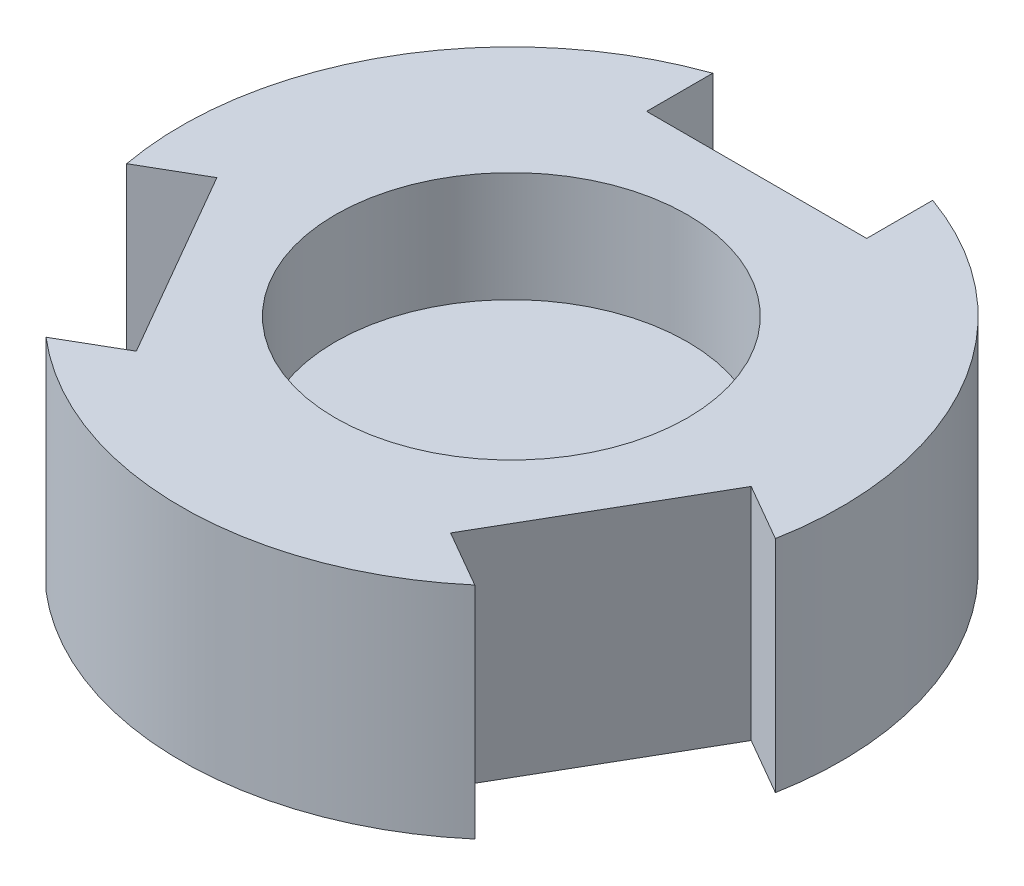
ISO-10303-21;
HEADER;
FILE_DESCRIPTION(('STEP AP214'),'2;1');
FILE_NAME('part.step','',(''),(''),'','','');
FILE_SCHEMA(('AUTOMOTIVE_DESIGN { 1 0 10303 214 1 1 1 1 }'));
ENDSEC;
DATA;
#1=APPLICATION_CONTEXT('core data for automotive mechanical design processes');
#2=APPLICATION_PROTOCOL_DEFINITION('international standard','automotive_design',2000,#1);
#3=PRODUCT_CONTEXT('',#1,'mechanical');
#4=PRODUCT('Part','Part','',(#3));
#5=PRODUCT_RELATED_PRODUCT_CATEGORY('part','',(#4));
#6=PRODUCT_DEFINITION_FORMATION('','',#4);
#7=PRODUCT_DEFINITION_CONTEXT('part definition',#1,'design');
#8=PRODUCT_DEFINITION('design','',#6,#7);
#9=PRODUCT_DEFINITION_SHAPE('','',#8);
#10=(LENGTH_UNIT() NAMED_UNIT(*) SI_UNIT(.MILLI.,.METRE.));
#11=(NAMED_UNIT(*) PLANE_ANGLE_UNIT() SI_UNIT($,.RADIAN.));
#12=(NAMED_UNIT(*) SI_UNIT($,.STERADIAN.) SOLID_ANGLE_UNIT());
#13=UNCERTAINTY_MEASURE_WITH_UNIT(LENGTH_MEASURE(1.E-05),#10,'distance_accuracy_value','');
#14=(GEOMETRIC_REPRESENTATION_CONTEXT(3) GLOBAL_UNCERTAINTY_ASSIGNED_CONTEXT((#13)) GLOBAL_UNIT_ASSIGNED_CONTEXT((#10,
#11,#12)) REPRESENTATION_CONTEXT('',''));
#15=CARTESIAN_POINT('',(0.,0.,0.));
#16=DIRECTION('',(0.,0.,1.));
#17=DIRECTION('',(1.,0.,0.));
#18=AXIS2_PLACEMENT_3D('',#15,#16,#17);
#19=CARTESIAN_POINT('',(0.,10.,0.));
#20=DIRECTION('',(0.,-1.,0.));
#21=DIRECTION('',(0.,0.,-1.));
#22=AXIS2_PLACEMENT_3D('',#19,#20,#21);
#23=CYLINDRICAL_SURFACE('',#22,15.);
#24=CARTESIAN_POINT('',(0.,10.,0.));
#25=DIRECTION('',(0.,1.,0.));
#26=DIRECTION('',(0.,0.,1.));
#27=AXIS2_PLACEMENT_3D('',#24,#25,#26);
#28=CIRCLE('',#27,15.);
#29=CARTESIAN_POINT('',(-4.99312831053746,10.,-14.1445632549934));
#30=VERTEX_POINT('',#29);
#31=CARTESIAN_POINT('',(-14.7487789152188,10.,2.73377404150312));
#32=VERTEX_POINT('',#31);
#33=EDGE_CURVE('E50',#30,#32,#28,.T.);
#34=ORIENTED_EDGE('',*,*,#33,.F.);
#35=DIRECTION('',(0.,-1.,0.));
#36=VECTOR('',#35,1.);
#37=CARTESIAN_POINT('',(-4.99312831053746,10.,-14.1445632549934));
#38=LINE('',#37,#36);
#39=CARTESIAN_POINT('',(-4.99312831053746,0.,-14.1445632549934));
#40=VERTEX_POINT('',#39);
#41=EDGE_CURVE('E148',#40,#30,#38,.F.);
#42=ORIENTED_EDGE('',*,*,#41,.F.);
#43=CARTESIAN_POINT('',(0.,0.,0.));
#44=DIRECTION('',(0.,1.,0.));
#45=DIRECTION('',(0.,0.,1.));
#46=AXIS2_PLACEMENT_3D('',#43,#44,#45);
#47=CIRCLE('',#46,15.);
#48=CARTESIAN_POINT('',(-14.7487789152188,0.,2.73377404150313));
#49=VERTEX_POINT('',#48);
#50=EDGE_CURVE('E211',#40,#49,#47,.T.);
#51=ORIENTED_EDGE('',*,*,#50,.T.);
#52=DIRECTION('',(0.,-1.,0.));
#53=VECTOR('',#52,1.);
#54=CARTESIAN_POINT('',(-14.7487789152188,10.,2.73377404150313));
#55=LINE('',#54,#53);
#56=EDGE_CURVE('E198',#32,#49,#55,.T.);
#57=ORIENTED_EDGE('',*,*,#56,.F.);
#58=EDGE_LOOP('',(#34,#42,#51,#57));
#59=FACE_BOUND('',#58,.T.);
#60=ADVANCED_FACE('F41',(#59),#23,.T.);
#61=CARTESIAN_POINT('',(14.746115259529,0.,2.74810566621536));
#62=VERTEX_POINT('',#61);
#63=CARTESIAN_POINT('',(5.00687168946161,0.,-14.1397042361312));
#64=VERTEX_POINT('',#63);
#65=EDGE_CURVE('E147',#62,#64,#47,.T.);
#66=ORIENTED_EDGE('',*,*,#65,.T.);
#67=DIRECTION('',(0.,-1.,0.));
#68=VECTOR('',#67,1.);
#69=CARTESIAN_POINT('',(5.00687168946161,10.,-14.1397042361312));
#70=LINE('',#69,#68);
#71=CARTESIAN_POINT('',(5.00687168946161,10.,-14.1397042361312));
#72=VERTEX_POINT('',#71);
#73=EDGE_CURVE('E134',#72,#64,#70,.T.);
#74=ORIENTED_EDGE('',*,*,#73,.F.);
#75=CARTESIAN_POINT('',(14.746115259529,10.,2.74810566621536));
#76=VERTEX_POINT('',#75);
#77=EDGE_CURVE('E11',#76,#72,#28,.T.);
#78=ORIENTED_EDGE('',*,*,#77,.F.);
#79=DIRECTION('',(0.,-1.,0.));
#80=VECTOR('',#79,1.);
#81=CARTESIAN_POINT('',(14.746115259529,10.,2.74810566621536));
#82=LINE('',#81,#80);
#83=EDGE_CURVE('E174',#62,#76,#82,.F.);
#84=ORIENTED_EDGE('',*,*,#83,.F.);
#85=EDGE_LOOP('',(#66,#74,#78,#84));
#86=FACE_BOUND('',#85,.T.);
#87=ADVANCED_FACE('F144',(#86),#23,.T.);
#88=CARTESIAN_POINT('',(-9.75298694899117,0.,11.3964575887777));
#89=VERTEX_POINT('',#88);
#90=CARTESIAN_POINT('',(9.74190722575777,0.,11.4059301946281));
#91=VERTEX_POINT('',#90);
#92=EDGE_CURVE('E45',#89,#91,#47,.T.);
#93=ORIENTED_EDGE('',*,*,#92,.T.);
#94=DIRECTION('',(0.,-1.,0.));
#95=VECTOR('',#94,1.);
#96=CARTESIAN_POINT('',(9.74190722575777,10.,11.4059301946281));
#97=LINE('',#96,#95);
#98=CARTESIAN_POINT('',(9.74190722575777,10.,11.4059301946281));
#99=VERTEX_POINT('',#98);
#100=EDGE_CURVE('E149',#99,#91,#97,.T.);
#101=ORIENTED_EDGE('',*,*,#100,.F.);
#102=CARTESIAN_POINT('',(-9.75298694899116,10.,11.3964575887777));
#103=VERTEX_POINT('',#102);
#104=EDGE_CURVE('E51',#103,#99,#28,.T.);
#105=ORIENTED_EDGE('',*,*,#104,.F.);
#106=DIRECTION('',(0.,-1.,0.));
#107=VECTOR('',#106,1.);
#108=CARTESIAN_POINT('',(-9.75298694899117,10.,11.3964575887777));
#109=LINE('',#108,#107);
#110=EDGE_CURVE('E196',#89,#103,#109,.F.);
#111=ORIENTED_EDGE('',*,*,#110,.F.);
#112=EDGE_LOOP('',(#93,#101,#105,#111));
#113=FACE_BOUND('',#112,.T.);
#114=ADVANCED_FACE('F43',(#113),#23,.T.);
#115=CARTESIAN_POINT('',(0.,10.,0.));
#116=DIRECTION('',(0.,1.,0.));
#117=DIRECTION('',(0.,0.,1.));
#118=AXIS2_PLACEMENT_3D('',#115,#116,#117);
#119=PLANE('',#118);
#120=DIRECTION('',(0.,0.,1.));
#121=VECTOR('',#120,1.);
#122=CARTESIAN_POINT('',(-4.99312831053746,10.,-14.139704236132));
#123=LINE('',#122,#121);
#124=CARTESIAN_POINT('',(-4.99312831053747,10.,-11.1397042361319));
#125=VERTEX_POINT('',#124);
#126=EDGE_CURVE('E138',#30,#125,#123,.T.);
#127=ORIENTED_EDGE('',*,*,#126,.F.);
#128=ORIENTED_EDGE('',*,*,#33,.T.);
#129=DIRECTION('',(-0.866025403784439,0.,0.5));
#130=VECTOR('',#129,1.);
#131=CARTESIAN_POINT('',(-16.8261955651492,10.,3.93317110355943));
#132=LINE('',#131,#130);
#133=CARTESIAN_POINT('',(-12.1507027038655,10.,1.23377404150313));
#134=VERTEX_POINT('',#133);
#135=EDGE_CURVE('E186',#134,#32,#132,.T.);
#136=ORIENTED_EDGE('',*,*,#135,.F.);
#137=DIRECTION('',(-0.5,0.,-0.866025403784439));
#138=VECTOR('',#137,1.);
#139=CARTESIAN_POINT('',(-12.1507027038655,10.,1.23377404150313));
#140=LINE('',#139,#138);
#141=CARTESIAN_POINT('',(-7.15070270386598,10.,9.89402807934672));
#142=VERTEX_POINT('',#141);
#143=EDGE_CURVE('E188',#142,#134,#140,.T.);
#144=ORIENTED_EDGE('',*,*,#143,.F.);
#145=DIRECTION('',(0.866025403784439,0.,-0.5));
#146=VECTOR('',#145,1.);
#147=CARTESIAN_POINT('',(-9.74877891521943,10.,11.3940280793468));
#148=LINE('',#147,#146);
#149=EDGE_CURVE('E182',#103,#142,#148,.T.);
#150=ORIENTED_EDGE('',*,*,#149,.F.);
#151=ORIENTED_EDGE('',*,*,#104,.T.);
#152=DIRECTION('',(0.866025403784438,0.,0.500000000000001));
#153=VECTOR('',#152,1.);
#154=CARTESIAN_POINT('',(11.8193238756885,10.,12.6053272566846));
#155=LINE('',#154,#153);
#156=CARTESIAN_POINT('',(7.14383101440485,10.,9.90593019462831));
#157=VERTEX_POINT('',#156);
#158=EDGE_CURVE('E162',#157,#99,#155,.T.);
#159=ORIENTED_EDGE('',*,*,#158,.F.);
#160=DIRECTION('',(-0.5,0.,0.866025403784438));
#161=VECTOR('',#160,1.);
#162=CARTESIAN_POINT('',(7.14383101440485,10.,9.90593019462831));
#163=LINE('',#162,#161);
#164=CARTESIAN_POINT('',(12.1438310144044,10.,1.24567615678472));
#165=VERTEX_POINT('',#164);
#166=EDGE_CURVE('E159',#165,#157,#163,.T.);
#167=ORIENTED_EDGE('',*,*,#166,.F.);
#168=DIRECTION('',(-0.866025403784438,0.,-0.500000000000001));
#169=VECTOR('',#168,1.);
#170=CARTESIAN_POINT('',(14.7419072257578,10.,2.7456761567848));
#171=LINE('',#170,#169);
#172=EDGE_CURVE('E157',#76,#165,#171,.T.);
#173=ORIENTED_EDGE('',*,*,#172,.F.);
#174=ORIENTED_EDGE('',*,*,#77,.T.);
#175=DIRECTION('',(0.,0.,-1.));
#176=VECTOR('',#175,1.);
#177=CARTESIAN_POINT('',(5.00687168946162,10.,-16.5384983602445));
#178=LINE('',#177,#176);
#179=CARTESIAN_POINT('',(5.00687168946161,10.,-11.1397042361318));
#180=VERTEX_POINT('',#179);
#181=EDGE_CURVE('E131',#180,#72,#178,.T.);
#182=ORIENTED_EDGE('',*,*,#181,.F.);
#183=DIRECTION('',(1.,0.,0.));
#184=VECTOR('',#183,1.);
#185=CARTESIAN_POINT('',(5.00687168946161,10.,-11.1397042361318));
#186=LINE('',#185,#184);
#187=EDGE_CURVE('E139',#125,#180,#186,.T.);
#188=ORIENTED_EDGE('',*,*,#187,.F.);
#189=EDGE_LOOP('',(#127,#128,#136,#144,#150,#151,#159,#167,#173,#174,#182,#188));
#190=FACE_BOUND('',#189,.T.);
#191=CARTESIAN_POINT('',(0.,10.,0.));
#192=DIRECTION('',(0.,1.,0.));
#193=DIRECTION('',(0.,0.,1.));
#194=AXIS2_PLACEMENT_3D('',#191,#192,#193);
#195=CIRCLE('',#194,8.);
#196=CARTESIAN_POINT('',(0.,10.,8.));
#197=VERTEX_POINT('',#196);
#198=EDGE_CURVE('E204',#197,#197,#195,.T.);
#199=ORIENTED_EDGE('',*,*,#198,.F.);
#200=EDGE_LOOP('',(#199));
#201=FACE_BOUND('',#200,.T.);
#202=ADVANCED_FACE('F153',(#190,#201),#119,.T.);
#203=CARTESIAN_POINT('',(0.,0.,0.));
#204=DIRECTION('',(0.,1.,0.));
#205=DIRECTION('',(0.,0.,1.));
#206=AXIS2_PLACEMENT_3D('',#203,#204,#205);
#207=PLANE('',#206);
#208=ORIENTED_EDGE('',*,*,#50,.F.);
#209=DIRECTION('',(0.,0.,-1.));
#210=VECTOR('',#209,1.);
#211=CARTESIAN_POINT('',(-4.99312831053746,0.,-14.139704236132));
#212=LINE('',#211,#210);
#213=CARTESIAN_POINT('',(-4.99312831053747,0.,-11.1397042361319));
#214=VERTEX_POINT('',#213);
#215=EDGE_CURVE('E233',#214,#40,#212,.T.);
#216=ORIENTED_EDGE('',*,*,#215,.F.);
#217=DIRECTION('',(-1.,0.,0.));
#218=VECTOR('',#217,1.);
#219=CARTESIAN_POINT('',(5.00687168946161,0.,-11.1397042361318));
#220=LINE('',#219,#218);
#221=CARTESIAN_POINT('',(5.00687168946161,0.,-11.1397042361318));
#222=VERTEX_POINT('',#221);
#223=EDGE_CURVE('E206',#222,#214,#220,.T.);
#224=ORIENTED_EDGE('',*,*,#223,.F.);
#225=DIRECTION('',(0.,0.,1.));
#226=VECTOR('',#225,1.);
#227=CARTESIAN_POINT('',(5.00687168946162,0.,-16.5384983602445));
#228=LINE('',#227,#226);
#229=EDGE_CURVE('E231',#64,#222,#228,.T.);
#230=ORIENTED_EDGE('',*,*,#229,.F.);
#231=ORIENTED_EDGE('',*,*,#65,.F.);
#232=DIRECTION('',(0.866025403784438,0.,0.500000000000001));
#233=VECTOR('',#232,1.);
#234=CARTESIAN_POINT('',(14.7419072257578,0.,2.7456761567848));
#235=LINE('',#234,#233);
#236=CARTESIAN_POINT('',(12.1438310144044,0.,1.24567615678472));
#237=VERTEX_POINT('',#236);
#238=EDGE_CURVE('E170',#237,#62,#235,.T.);
#239=ORIENTED_EDGE('',*,*,#238,.F.);
#240=DIRECTION('',(0.5,0.,-0.866025403784438));
#241=VECTOR('',#240,1.);
#242=CARTESIAN_POINT('',(7.14383101440485,0.,9.90593019462831));
#243=LINE('',#242,#241);
#244=CARTESIAN_POINT('',(7.14383101440485,0.,9.90593019462831));
#245=VERTEX_POINT('',#244);
#246=EDGE_CURVE('E200',#245,#237,#243,.T.);
#247=ORIENTED_EDGE('',*,*,#246,.F.);
#248=DIRECTION('',(-0.866025403784438,0.,-0.500000000000001));
#249=VECTOR('',#248,1.);
#250=CARTESIAN_POINT('',(11.8193238756885,0.,12.6053272566846));
#251=LINE('',#250,#249);
#252=EDGE_CURVE('E172',#91,#245,#251,.T.);
#253=ORIENTED_EDGE('',*,*,#252,.F.);
#254=ORIENTED_EDGE('',*,*,#92,.F.);
#255=DIRECTION('',(-0.866025403784439,0.,0.5));
#256=VECTOR('',#255,1.);
#257=CARTESIAN_POINT('',(-9.74877891521943,0.,11.3940280793468));
#258=LINE('',#257,#256);
#259=CARTESIAN_POINT('',(-7.15070270386598,0.,9.89402807934672));
#260=VERTEX_POINT('',#259);
#261=EDGE_CURVE('E191',#260,#89,#258,.T.);
#262=ORIENTED_EDGE('',*,*,#261,.F.);
#263=DIRECTION('',(0.5,0.,0.866025403784439));
#264=VECTOR('',#263,1.);
#265=CARTESIAN_POINT('',(-12.1507027038655,0.,1.23377404150313));
#266=LINE('',#265,#264);
#267=CARTESIAN_POINT('',(-12.1507027038655,0.,1.23377404150313));
#268=VERTEX_POINT('',#267);
#269=EDGE_CURVE('E177',#268,#260,#266,.T.);
#270=ORIENTED_EDGE('',*,*,#269,.F.);
#271=DIRECTION('',(0.866025403784439,0.,-0.5));
#272=VECTOR('',#271,1.);
#273=CARTESIAN_POINT('',(-16.8261955651492,0.,3.93317110355943));
#274=LINE('',#273,#272);
#275=EDGE_CURVE('E193',#49,#268,#274,.T.);
#276=ORIENTED_EDGE('',*,*,#275,.F.);
#277=EDGE_LOOP('',(#208,#216,#224,#230,#231,#239,#247,#253,#254,#262,#270,#276));
#278=FACE_BOUND('',#277,.T.);
#279=ADVANCED_FACE('F222',(#278),#207,.F.);
#280=CARTESIAN_POINT('',(0.,5.,0.));
#281=DIRECTION('',(0.,1.,0.));
#282=DIRECTION('',(0.,0.,1.));
#283=AXIS2_PLACEMENT_3D('',#280,#281,#282);
#284=CYLINDRICAL_SURFACE('',#283,8.);
#285=CARTESIAN_POINT('',(0.,5.,0.));
#286=DIRECTION('',(0.,1.,0.));
#287=DIRECTION('',(0.,0.,1.));
#288=AXIS2_PLACEMENT_3D('',#285,#286,#287);
#289=CIRCLE('',#288,8.);
#290=CARTESIAN_POINT('',(0.,5.,8.));
#291=VERTEX_POINT('',#290);
#292=EDGE_CURVE('E201',#291,#291,#289,.T.);
#293=ORIENTED_EDGE('',*,*,#292,.F.);
#294=EDGE_LOOP('',(#293));
#295=FACE_BOUND('',#294,.T.);
#296=ORIENTED_EDGE('',*,*,#198,.T.);
#297=EDGE_LOOP('',(#296));
#298=FACE_BOUND('',#297,.T.);
#299=ADVANCED_FACE('F272',(#295,#298),#284,.F.);
#300=CARTESIAN_POINT('',(0.,5.,0.));
#301=DIRECTION('',(0.,1.,0.));
#302=DIRECTION('',(0.,0.,1.));
#303=AXIS2_PLACEMENT_3D('',#300,#301,#302);
#304=PLANE('',#303);
#305=ORIENTED_EDGE('',*,*,#292,.T.);
#306=EDGE_LOOP('',(#305));
#307=FACE_BOUND('',#306,.T.);
#308=ADVANCED_FACE('F264',(#307),#304,.T.);
#309=CARTESIAN_POINT('',(-9.74877891521943,-0.000999999999999265,11.3940280793468));
#310=DIRECTION('',(0.5,0.,0.866025403784439));
#311=DIRECTION('',(0.866025403784439,0.,-0.5));
#312=AXIS2_PLACEMENT_3D('',#309,#310,#311);
#313=PLANE('',#312);
#314=ORIENTED_EDGE('',*,*,#110,.T.);
#315=ORIENTED_EDGE('',*,*,#149,.T.);
#316=DIRECTION('',(0.,1.,0.));
#317=VECTOR('',#316,1.);
#318=CARTESIAN_POINT('',(-7.15070270386598,-0.000999999999999265,9.89402807934672));
#319=LINE('',#318,#317);
#320=EDGE_CURVE('E180',#260,#142,#319,.T.);
#321=ORIENTED_EDGE('',*,*,#320,.F.);
#322=ORIENTED_EDGE('',*,*,#261,.T.);
#323=EDGE_LOOP('',(#314,#315,#321,#322));
#324=FACE_BOUND('',#323,.T.);
#325=ADVANCED_FACE('F262',(#324),#313,.F.);
#326=CARTESIAN_POINT('',(-16.8261955651492,-0.000999999999999265,3.93317110355943));
#327=DIRECTION('',(-0.5,0.,-0.866025403784439));
#328=DIRECTION('',(-0.866025403784439,0.,0.5));
#329=AXIS2_PLACEMENT_3D('',#326,#327,#328);
#330=PLANE('',#329);
#331=ORIENTED_EDGE('',*,*,#56,.T.);
#332=ORIENTED_EDGE('',*,*,#275,.T.);
#333=DIRECTION('',(0.,1.,0.));
#334=VECTOR('',#333,1.);
#335=CARTESIAN_POINT('',(-12.1507027038655,-0.000999999999999265,1.23377404150313));
#336=LINE('',#335,#334);
#337=EDGE_CURVE('E179',#268,#134,#336,.T.);
#338=ORIENTED_EDGE('',*,*,#337,.T.);
#339=ORIENTED_EDGE('',*,*,#135,.T.);
#340=EDGE_LOOP('',(#331,#332,#338,#339));
#341=FACE_BOUND('',#340,.T.);
#342=ADVANCED_FACE('F257',(#341),#330,.F.);
#343=CARTESIAN_POINT('',(-12.1507027038655,-0.000999999999999265,1.23377404150313));
#344=DIRECTION('',(0.866025403784439,0.,-0.5));
#345=DIRECTION('',(-0.5,0.,-0.866025403784439));
#346=AXIS2_PLACEMENT_3D('',#343,#344,#345);
#347=PLANE('',#346);
#348=ORIENTED_EDGE('',*,*,#269,.T.);
#349=ORIENTED_EDGE('',*,*,#320,.T.);
#350=ORIENTED_EDGE('',*,*,#143,.T.);
#351=ORIENTED_EDGE('',*,*,#337,.F.);
#352=EDGE_LOOP('',(#348,#349,#350,#351));
#353=FACE_BOUND('',#352,.T.);
#354=ADVANCED_FACE('F259',(#353),#347,.F.);
#355=CARTESIAN_POINT('',(14.7419072257578,-0.000999999999999265,2.7456761567848));
#356=DIRECTION('',(0.500000000000001,0.,-0.866025403784438));
#357=DIRECTION('',(-0.866025403784438,0.,-0.500000000000001));
#358=AXIS2_PLACEMENT_3D('',#355,#356,#357);
#359=PLANE('',#358);
#360=ORIENTED_EDGE('',*,*,#83,.T.);
#361=ORIENTED_EDGE('',*,*,#172,.T.);
#362=DIRECTION('',(0.,1.,0.));
#363=VECTOR('',#362,1.);
#364=CARTESIAN_POINT('',(12.1438310144044,-0.000999999999999265,1.24567615678472));
#365=LINE('',#364,#363);
#366=EDGE_CURVE('E163',#237,#165,#365,.T.);
#367=ORIENTED_EDGE('',*,*,#366,.F.);
#368=ORIENTED_EDGE('',*,*,#238,.T.);
#369=EDGE_LOOP('',(#360,#361,#367,#368));
#370=FACE_BOUND('',#369,.T.);
#371=ADVANCED_FACE('F229',(#370),#359,.F.);
#372=CARTESIAN_POINT('',(11.8193238756885,-0.000999999999999265,12.6053272566846));
#373=DIRECTION('',(-0.500000000000001,0.,0.866025403784438));
#374=DIRECTION('',(0.866025403784438,0.,0.500000000000001));
#375=AXIS2_PLACEMENT_3D('',#372,#373,#374);
#376=PLANE('',#375);
#377=ORIENTED_EDGE('',*,*,#100,.T.);
#378=ORIENTED_EDGE('',*,*,#252,.T.);
#379=DIRECTION('',(0.,1.,0.));
#380=VECTOR('',#379,1.);
#381=CARTESIAN_POINT('',(7.14383101440485,-0.000999999999999265,9.90593019462831));
#382=LINE('',#381,#380);
#383=EDGE_CURVE('E66',#245,#157,#382,.T.);
#384=ORIENTED_EDGE('',*,*,#383,.T.);
#385=ORIENTED_EDGE('',*,*,#158,.T.);
#386=EDGE_LOOP('',(#377,#378,#384,#385));
#387=FACE_BOUND('',#386,.T.);
#388=ADVANCED_FACE('F227',(#387),#376,.F.);
#389=CARTESIAN_POINT('',(7.14383101440485,-0.000999999999999265,9.90593019462831));
#390=DIRECTION('',(-0.866025403784438,0.,-0.5));
#391=DIRECTION('',(-0.5,0.,0.866025403784438));
#392=AXIS2_PLACEMENT_3D('',#389,#390,#391);
#393=PLANE('',#392);
#394=ORIENTED_EDGE('',*,*,#246,.T.);
#395=ORIENTED_EDGE('',*,*,#366,.T.);
#396=ORIENTED_EDGE('',*,*,#166,.T.);
#397=ORIENTED_EDGE('',*,*,#383,.F.);
#398=EDGE_LOOP('',(#394,#395,#396,#397));
#399=FACE_BOUND('',#398,.T.);
#400=ADVANCED_FACE('F228',(#399),#393,.F.);
#401=CARTESIAN_POINT('',(-4.99312831053746,-0.000999999999999265,-14.139704236132));
#402=DIRECTION('',(-1.,0.,0.));
#403=DIRECTION('',(0.,0.,1.));
#404=AXIS2_PLACEMENT_3D('',#401,#402,#403);
#405=PLANE('',#404);
#406=ORIENTED_EDGE('',*,*,#41,.T.);
#407=ORIENTED_EDGE('',*,*,#126,.T.);
#408=DIRECTION('',(0.,1.,0.));
#409=VECTOR('',#408,1.);
#410=CARTESIAN_POINT('',(-4.99312831053747,-0.000999999999999265,-11.1397042361319));
#411=LINE('',#410,#409);
#412=EDGE_CURVE('E241',#214,#125,#411,.T.);
#413=ORIENTED_EDGE('',*,*,#412,.F.);
#414=ORIENTED_EDGE('',*,*,#215,.T.);
#415=EDGE_LOOP('',(#406,#407,#413,#414));
#416=FACE_BOUND('',#415,.T.);
#417=ADVANCED_FACE('F248',(#416),#405,.F.);
#418=CARTESIAN_POINT('',(5.00687168946162,-0.000999999999999265,-16.5384983602445));
#419=DIRECTION('',(1.,0.,0.));
#420=DIRECTION('',(0.,0.,-1.));
#421=AXIS2_PLACEMENT_3D('',#418,#419,#420);
#422=PLANE('',#421);
#423=ORIENTED_EDGE('',*,*,#73,.T.);
#424=ORIENTED_EDGE('',*,*,#229,.T.);
#425=DIRECTION('',(0.,1.,0.));
#426=VECTOR('',#425,1.);
#427=CARTESIAN_POINT('',(5.00687168946161,-0.000999999999999265,-11.1397042361318));
#428=LINE('',#427,#426);
#429=EDGE_CURVE('E58',#222,#180,#428,.T.);
#430=ORIENTED_EDGE('',*,*,#429,.T.);
#431=ORIENTED_EDGE('',*,*,#181,.T.);
#432=EDGE_LOOP('',(#423,#424,#430,#431));
#433=FACE_BOUND('',#432,.T.);
#434=ADVANCED_FACE('F133',(#433),#422,.F.);
#435=CARTESIAN_POINT('',(5.00687168946161,-0.000999999999999265,-11.1397042361318));
#436=DIRECTION('',(0.,0.,1.));
#437=DIRECTION('',(1.,0.,0.));
#438=AXIS2_PLACEMENT_3D('',#435,#436,#437);
#439=PLANE('',#438);
#440=ORIENTED_EDGE('',*,*,#223,.T.);
#441=ORIENTED_EDGE('',*,*,#412,.T.);
#442=ORIENTED_EDGE('',*,*,#187,.T.);
#443=ORIENTED_EDGE('',*,*,#429,.F.);
#444=EDGE_LOOP('',(#440,#441,#442,#443));
#445=FACE_BOUND('',#444,.T.);
#446=ADVANCED_FACE('F246',(#445),#439,.F.);
#447=CLOSED_SHELL('',(#60,#87,#114,#202,#279,#299,#308,#325,#342,#354,#371,#388,#400,#417,#434,#446));
#448=MANIFOLD_SOLID_BREP('B2',#447);
#449=ADVANCED_BREP_SHAPE_REPRESENTATION('',(#18,#448),#14);
#450=SHAPE_DEFINITION_REPRESENTATION(#9,#449);
ENDSEC;
END-ISO-10303-21;
